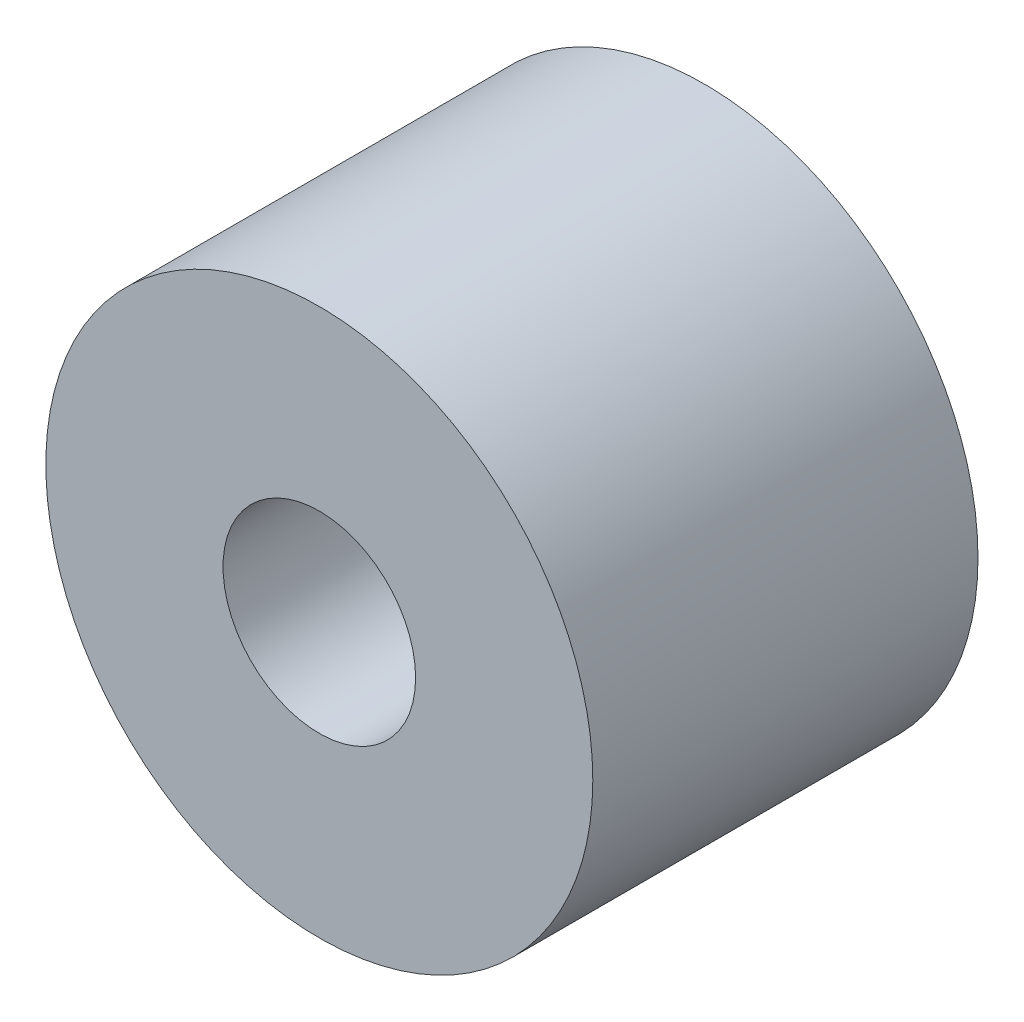
ISO-10303-21;
HEADER;
FILE_DESCRIPTION(('STEP AP214'),'2;1');
FILE_NAME('part.step','',(''),(''),'','','');
FILE_SCHEMA(('AUTOMOTIVE_DESIGN { 1 0 10303 214 1 1 1 1 }'));
ENDSEC;
DATA;
#1=APPLICATION_CONTEXT('core data for automotive mechanical design processes');
#2=APPLICATION_PROTOCOL_DEFINITION('international standard','automotive_design',2000,#1);
#3=PRODUCT_CONTEXT('',#1,'mechanical');
#4=PRODUCT('Part','Part','',(#3));
#5=PRODUCT_RELATED_PRODUCT_CATEGORY('part','',(#4));
#6=PRODUCT_DEFINITION_FORMATION('','',#4);
#7=PRODUCT_DEFINITION_CONTEXT('part definition',#1,'design');
#8=PRODUCT_DEFINITION('design','',#6,#7);
#9=PRODUCT_DEFINITION_SHAPE('','',#8);
#10=(LENGTH_UNIT() NAMED_UNIT(*) SI_UNIT(.MILLI.,.METRE.));
#11=(NAMED_UNIT(*) PLANE_ANGLE_UNIT() SI_UNIT($,.RADIAN.));
#12=(NAMED_UNIT(*) SI_UNIT($,.STERADIAN.) SOLID_ANGLE_UNIT());
#13=UNCERTAINTY_MEASURE_WITH_UNIT(LENGTH_MEASURE(1.E-05),#10,'distance_accuracy_value','');
#14=(GEOMETRIC_REPRESENTATION_CONTEXT(3) GLOBAL_UNCERTAINTY_ASSIGNED_CONTEXT((#13)) GLOBAL_UNIT_ASSIGNED_CONTEXT((#10,
#11,#12)) REPRESENTATION_CONTEXT('',''));
#15=CARTESIAN_POINT('',(0.,0.,0.));
#16=DIRECTION('',(0.,0.,1.));
#17=DIRECTION('',(1.,0.,0.));
#18=AXIS2_PLACEMENT_3D('',#15,#16,#17);
#19=CARTESIAN_POINT('',(0.,0.,20.));
#20=DIRECTION('',(0.,0.,1.));
#21=DIRECTION('',(1.,0.,0.));
#22=AXIS2_PLACEMENT_3D('',#19,#20,#21);
#23=PLANE('',#22);
#24=CARTESIAN_POINT('',(0.,0.,20.));
#25=DIRECTION('',(0.,0.,1.));
#26=DIRECTION('',(1.,0.,0.));
#27=AXIS2_PLACEMENT_3D('',#24,#25,#26);
#28=CIRCLE('',#27,14.2);
#29=CARTESIAN_POINT('',(14.2,0.,20.));
#30=VERTEX_POINT('',#29);
#31=EDGE_CURVE('E10',#30,#30,#28,.T.);
#32=ORIENTED_EDGE('',*,*,#31,.T.);
#33=EDGE_LOOP('',(#32));
#34=FACE_BOUND('',#33,.T.);
#35=CARTESIAN_POINT('',(0.,0.,20.));
#36=DIRECTION('',(0.,0.,1.));
#37=DIRECTION('',(1.,0.,0.));
#38=AXIS2_PLACEMENT_3D('',#35,#36,#37);
#39=CIRCLE('',#38,5.);
#40=CARTESIAN_POINT('',(5.,0.,20.));
#41=VERTEX_POINT('',#40);
#42=EDGE_CURVE('E54',#41,#41,#39,.T.);
#43=ORIENTED_EDGE('',*,*,#42,.F.);
#44=EDGE_LOOP('',(#43));
#45=FACE_BOUND('',#44,.T.);
#46=ADVANCED_FACE('F41',(#34,#45),#23,.T.);
#47=CARTESIAN_POINT('',(0.,0.,0.));
#48=DIRECTION('',(0.,0.,1.));
#49=DIRECTION('',(1.,0.,0.));
#50=AXIS2_PLACEMENT_3D('',#47,#48,#49);
#51=PLANE('',#50);
#52=CARTESIAN_POINT('',(0.,0.,0.));
#53=DIRECTION('',(0.,0.,1.));
#54=DIRECTION('',(1.,0.,0.));
#55=AXIS2_PLACEMENT_3D('',#52,#53,#54);
#56=CIRCLE('',#55,14.2);
#57=CARTESIAN_POINT('',(14.2,0.,0.));
#58=VERTEX_POINT('',#57);
#59=EDGE_CURVE('E44',#58,#58,#56,.T.);
#60=ORIENTED_EDGE('',*,*,#59,.F.);
#61=EDGE_LOOP('',(#60));
#62=FACE_BOUND('',#61,.T.);
#63=CARTESIAN_POINT('',(0.,0.,0.));
#64=DIRECTION('',(0.,0.,1.));
#65=DIRECTION('',(1.,0.,0.));
#66=AXIS2_PLACEMENT_3D('',#63,#64,#65);
#67=CIRCLE('',#66,5.);
#68=CARTESIAN_POINT('',(5.,0.,0.));
#69=VERTEX_POINT('',#68);
#70=EDGE_CURVE('E60',#69,#69,#67,.T.);
#71=ORIENTED_EDGE('',*,*,#70,.T.);
#72=EDGE_LOOP('',(#71));
#73=FACE_BOUND('',#72,.T.);
#74=ADVANCED_FACE('F69',(#62,#73),#51,.F.);
#75=CARTESIAN_POINT('',(0.,0.,20.));
#76=DIRECTION('',(0.,0.,-1.));
#77=DIRECTION('',(-1.,0.,0.));
#78=AXIS2_PLACEMENT_3D('',#75,#76,#77);
#79=CYLINDRICAL_SURFACE('',#78,14.2);
#80=ORIENTED_EDGE('',*,*,#31,.F.);
#81=EDGE_LOOP('',(#80));
#82=FACE_BOUND('',#81,.T.);
#83=ORIENTED_EDGE('',*,*,#59,.T.);
#84=EDGE_LOOP('',(#83));
#85=FACE_BOUND('',#84,.T.);
#86=ADVANCED_FACE('F43',(#82,#85),#79,.T.);
#87=CARTESIAN_POINT('',(0.,0.,20.));
#88=DIRECTION('',(0.,0.,-1.));
#89=DIRECTION('',(-1.,0.,0.));
#90=AXIS2_PLACEMENT_3D('',#87,#88,#89);
#91=CYLINDRICAL_SURFACE('',#90,5.);
#92=ORIENTED_EDGE('',*,*,#42,.T.);
#93=EDGE_LOOP('',(#92));
#94=FACE_BOUND('',#93,.T.);
#95=ORIENTED_EDGE('',*,*,#70,.F.);
#96=EDGE_LOOP('',(#95));
#97=FACE_BOUND('',#96,.T.);
#98=ADVANCED_FACE('F63',(#94,#97),#91,.F.);
#99=CLOSED_SHELL('',(#46,#74,#86,#98));
#100=MANIFOLD_SOLID_BREP('B2',#99);
#101=ADVANCED_BREP_SHAPE_REPRESENTATION('',(#18,#100),#14);
#102=SHAPE_DEFINITION_REPRESENTATION(#9,#101);
ENDSEC;
END-ISO-10303-21;
